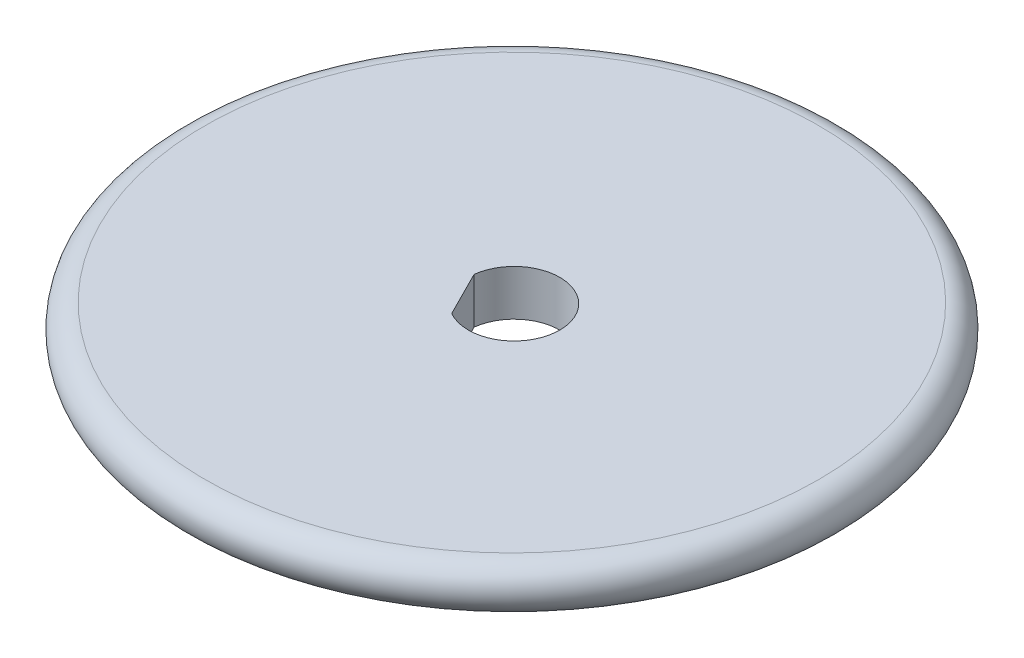
ISO-10303-21;
HEADER;
FILE_DESCRIPTION(('STEP AP214'),'2;1');
FILE_NAME('part.step','',(''),(''),'','','');
FILE_SCHEMA(('AUTOMOTIVE_DESIGN { 1 0 10303 214 1 1 1 1 }'));
ENDSEC;
DATA;
#1=APPLICATION_CONTEXT('core data for automotive mechanical design processes');
#2=APPLICATION_PROTOCOL_DEFINITION('international standard','automotive_design',2000,#1);
#3=PRODUCT_CONTEXT('',#1,'mechanical');
#4=PRODUCT('Part','Part','',(#3));
#5=PRODUCT_RELATED_PRODUCT_CATEGORY('part','',(#4));
#6=PRODUCT_DEFINITION_FORMATION('','',#4);
#7=PRODUCT_DEFINITION_CONTEXT('part definition',#1,'design');
#8=PRODUCT_DEFINITION('design','',#6,#7);
#9=PRODUCT_DEFINITION_SHAPE('','',#8);
#10=(LENGTH_UNIT() NAMED_UNIT(*) SI_UNIT(.MILLI.,.METRE.));
#11=(NAMED_UNIT(*) PLANE_ANGLE_UNIT() SI_UNIT($,.RADIAN.));
#12=(NAMED_UNIT(*) SI_UNIT($,.STERADIAN.) SOLID_ANGLE_UNIT());
#13=UNCERTAINTY_MEASURE_WITH_UNIT(LENGTH_MEASURE(1.E-05),#10,'distance_accuracy_value','');
#14=(GEOMETRIC_REPRESENTATION_CONTEXT(3) GLOBAL_UNCERTAINTY_ASSIGNED_CONTEXT((#13)) GLOBAL_UNIT_ASSIGNED_CONTEXT((#10,
#11,#12)) REPRESENTATION_CONTEXT('',''));
#15=CARTESIAN_POINT('',(0.,0.,0.));
#16=DIRECTION('',(0.,0.,1.));
#17=DIRECTION('',(1.,0.,0.));
#18=AXIS2_PLACEMENT_3D('',#15,#16,#17);
#19=CARTESIAN_POINT('',(0.,18.26337642131,0.));
#20=DIRECTION('',(0.,1.,0.));
#21=DIRECTION('',(-1.,0.,0.));
#22=AXIS2_PLACEMENT_3D('',#19,#20,#21);
#23=PLANE('',#22);
#24=CARTESIAN_POINT('',(0.114687368770255,18.26337642131,-0.00471076486796562));
#25=DIRECTION('',(0.,1.,0.));
#26=DIRECTION('',(-1.,0.,0.));
#27=AXIS2_PLACEMENT_3D('',#24,#25,#26);
#28=CIRCLE('',#27,2.54);
#29=CARTESIAN_POINT('',(-1.14512130543061,18.26337642131,2.20084633128898));
#30=VERTEX_POINT('',#29);
#31=CARTESIAN_POINT('',(-2.40767916953496,18.26337642131,-0.30348667828495));
#32=VERTEX_POINT('',#31);
#33=EDGE_CURVE('E49',#30,#32,#28,.T.);
#34=ORIENTED_EDGE('',*,*,#33,.F.);
#35=DIRECTION('',(0.450175238467399,0.,0.892940230178269));
#36=VECTOR('',#35,1.);
#37=CARTESIAN_POINT('',(-1.14512130543061,18.26337642131,2.20084633128898));
#38=LINE('',#37,#36);
#39=EDGE_CURVE('E68',#32,#30,#38,.T.);
#40=ORIENTED_EDGE('',*,*,#39,.F.);
#41=EDGE_LOOP('',(#34,#40));
#42=FACE_BOUND('',#41,.T.);
#43=CARTESIAN_POINT('',(0.,18.26337642131,0.));
#44=DIRECTION('',(0.,-1.,0.));
#45=DIRECTION('',(1.,0.,0.));
#46=AXIS2_PLACEMENT_3D('',#43,#44,#45);
#47=CIRCLE('',#46,17.0415037859707);
#48=CARTESIAN_POINT('',(17.0415037859707,18.26337642131,0.));
#49=VERTEX_POINT('',#48);
#50=EDGE_CURVE('E11',#49,#49,#47,.T.);
#51=ORIENTED_EDGE('',*,*,#50,.F.);
#52=EDGE_LOOP('',(#51));
#53=FACE_BOUND('',#52,.T.);
#54=ADVANCED_FACE('F35',(#42,#53),#23,.T.);
#55=CARTESIAN_POINT('',(0.,16.99337642131,0.));
#56=DIRECTION('',(0.,-1.,0.));
#57=DIRECTION('',(1.,0.,0.));
#58=AXIS2_PLACEMENT_3D('',#55,#56,#57);
#59=TOROIDAL_SURFACE('',#58,17.0415037859707,1.27);
#60=ORIENTED_EDGE('',*,*,#50,.T.);
#61=EDGE_LOOP('',(#60));
#62=FACE_BOUND('',#61,.T.);
#63=CARTESIAN_POINT('',(0.,15.72337642131,0.));
#64=DIRECTION('',(0.,-1.,0.));
#65=DIRECTION('',(1.,0.,0.));
#66=AXIS2_PLACEMENT_3D('',#63,#64,#65);
#67=CIRCLE('',#66,17.0415037859707);
#68=CARTESIAN_POINT('',(17.0415037859707,15.72337642131,0.));
#69=VERTEX_POINT('',#68);
#70=EDGE_CURVE('E42',#69,#69,#67,.T.);
#71=ORIENTED_EDGE('',*,*,#70,.F.);
#72=EDGE_LOOP('',(#71));
#73=FACE_BOUND('',#72,.T.);
#74=ADVANCED_FACE('F83',(#62,#73),#59,.T.);
#75=CARTESIAN_POINT('',(5.08,15.72337642131,0.));
#76=DIRECTION('',(0.,-1.,0.));
#77=DIRECTION('',(1.,0.,0.));
#78=AXIS2_PLACEMENT_3D('',#75,#76,#77);
#79=PLANE('',#78);
#80=CARTESIAN_POINT('',(0.114687368770256,15.72337642131,-0.00471076486796562));
#81=DIRECTION('',(0.,1.,0.));
#82=DIRECTION('',(-1.,0.,0.));
#83=AXIS2_PLACEMENT_3D('',#80,#81,#82);
#84=CIRCLE('',#83,2.54);
#85=CARTESIAN_POINT('',(-1.14512130543061,15.72337642131,2.20084633128898));
#86=VERTEX_POINT('',#85);
#87=CARTESIAN_POINT('',(-2.40767916953496,15.72337642131,-0.30348667828495));
#88=VERTEX_POINT('',#87);
#89=EDGE_CURVE('E54',#86,#88,#84,.T.);
#90=ORIENTED_EDGE('',*,*,#89,.T.);
#91=DIRECTION('',(0.450175238467399,0.,0.892940230178269));
#92=VECTOR('',#91,1.);
#93=CARTESIAN_POINT('',(-1.14512130543061,15.72337642131,2.20084633128898));
#94=LINE('',#93,#92);
#95=EDGE_CURVE('E75',#88,#86,#94,.T.);
#96=ORIENTED_EDGE('',*,*,#95,.T.);
#97=EDGE_LOOP('',(#90,#96));
#98=FACE_BOUND('',#97,.T.);
#99=ORIENTED_EDGE('',*,*,#70,.T.);
#100=EDGE_LOOP('',(#99));
#101=FACE_BOUND('',#100,.T.);
#102=ADVANCED_FACE('F81',(#98,#101),#79,.T.);
#103=CARTESIAN_POINT('',(0.114687368770256,15.72337642131,-0.00471076486796562));
#104=DIRECTION('',(0.,1.,0.));
#105=DIRECTION('',(-1.,0.,0.));
#106=AXIS2_PLACEMENT_3D('',#103,#104,#105);
#107=CYLINDRICAL_SURFACE('',#106,2.54);
#108=ORIENTED_EDGE('',*,*,#33,.T.);
#109=DIRECTION('',(0.,1.,0.));
#110=VECTOR('',#109,1.);
#111=CARTESIAN_POINT('',(-2.40767916953496,15.72337642131,-0.30348667828495));
#112=LINE('',#111,#110);
#113=EDGE_CURVE('E65',#88,#32,#112,.T.);
#114=ORIENTED_EDGE('',*,*,#113,.F.);
#115=ORIENTED_EDGE('',*,*,#89,.F.);
#116=DIRECTION('',(0.,1.,0.));
#117=VECTOR('',#116,1.);
#118=CARTESIAN_POINT('',(-1.14512130543061,15.72337642131,2.20084633128898));
#119=LINE('',#118,#117);
#120=EDGE_CURVE('E59',#86,#30,#119,.T.);
#121=ORIENTED_EDGE('',*,*,#120,.T.);
#122=EDGE_LOOP('',(#108,#114,#115,#121));
#123=FACE_BOUND('',#122,.T.);
#124=ADVANCED_FACE('F61',(#123),#107,.F.);
#125=CARTESIAN_POINT('',(-1.14512130543061,15.72337642131,2.20084633128898));
#126=DIRECTION('',(-0.892940230178269,0.,0.450175238467399));
#127=DIRECTION('',(0.450175238467399,0.,0.892940230178269));
#128=AXIS2_PLACEMENT_3D('',#125,#126,#127);
#129=PLANE('',#128);
#130=ORIENTED_EDGE('',*,*,#39,.T.);
#131=ORIENTED_EDGE('',*,*,#120,.F.);
#132=ORIENTED_EDGE('',*,*,#95,.F.);
#133=ORIENTED_EDGE('',*,*,#113,.T.);
#134=EDGE_LOOP('',(#130,#131,#132,#133));
#135=FACE_BOUND('',#134,.T.);
#136=ADVANCED_FACE('F69',(#135),#129,.F.);
#137=CLOSED_SHELL('',(#54,#74,#102,#124,#136));
#138=MANIFOLD_SOLID_BREP('B2',#137);
#139=ADVANCED_BREP_SHAPE_REPRESENTATION('',(#18,#138),#14);
#140=SHAPE_DEFINITION_REPRESENTATION(#9,#139);
ENDSEC;
END-ISO-10303-21;
